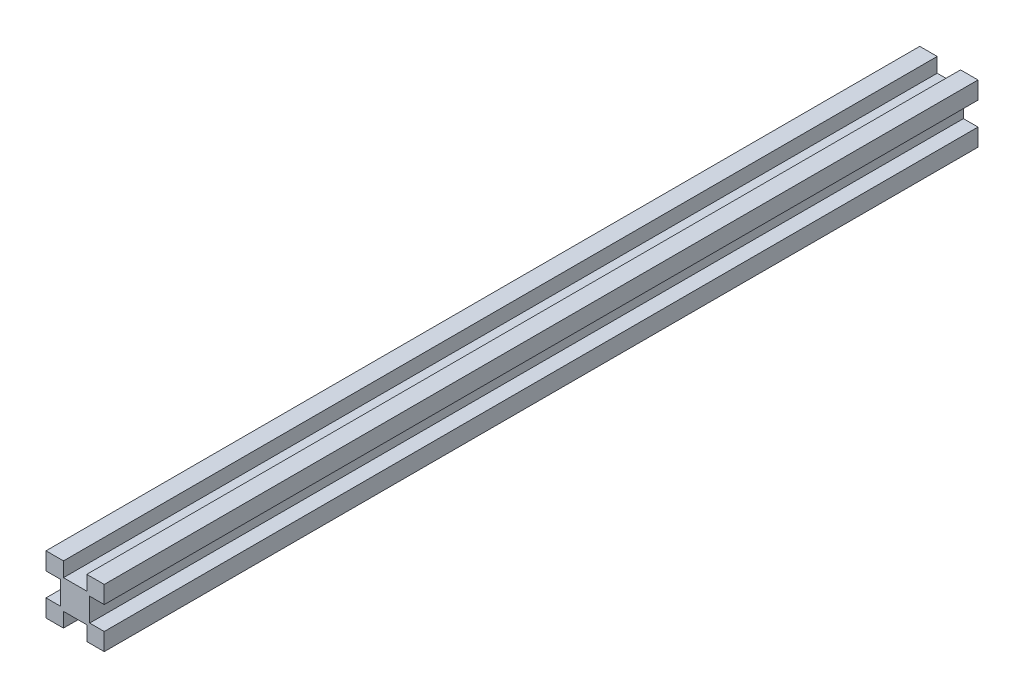
ISO-10303-21;
HEADER;
FILE_DESCRIPTION(('STEP AP214'),'2;1');
FILE_NAME('part.step','',(''),(''),'','','');
FILE_SCHEMA(('AUTOMOTIVE_DESIGN { 1 0 10303 214 1 1 1 1 }'));
ENDSEC;
DATA;
#1=APPLICATION_CONTEXT('core data for automotive mechanical design processes');
#2=APPLICATION_PROTOCOL_DEFINITION('international standard','automotive_design',2000,#1);
#3=PRODUCT_CONTEXT('',#1,'mechanical');
#4=PRODUCT('Part','Part','',(#3));
#5=PRODUCT_RELATED_PRODUCT_CATEGORY('part','',(#4));
#6=PRODUCT_DEFINITION_FORMATION('','',#4);
#7=PRODUCT_DEFINITION_CONTEXT('part definition',#1,'design');
#8=PRODUCT_DEFINITION('design','',#6,#7);
#9=PRODUCT_DEFINITION_SHAPE('','',#8);
#10=(LENGTH_UNIT() NAMED_UNIT(*) SI_UNIT(.MILLI.,.METRE.));
#11=(NAMED_UNIT(*) PLANE_ANGLE_UNIT() SI_UNIT($,.RADIAN.));
#12=(NAMED_UNIT(*) SI_UNIT($,.STERADIAN.) SOLID_ANGLE_UNIT());
#13=UNCERTAINTY_MEASURE_WITH_UNIT(LENGTH_MEASURE(1.E-05),#10,'distance_accuracy_value','');
#14=(GEOMETRIC_REPRESENTATION_CONTEXT(3) GLOBAL_UNCERTAINTY_ASSIGNED_CONTEXT((#13)) GLOBAL_UNIT_ASSIGNED_CONTEXT((#10,
#11,#12)) REPRESENTATION_CONTEXT('',''));
#15=CARTESIAN_POINT('',(0.,0.,0.));
#16=DIRECTION('',(0.,0.,1.));
#17=DIRECTION('',(1.,0.,0.));
#18=AXIS2_PLACEMENT_3D('',#15,#16,#17);
#19=CARTESIAN_POINT('',(-3.5325550493546,14.5416666666667,300.));
#20=DIRECTION('',(-1.,0.,0.));
#21=DIRECTION('',(0.,-1.,0.));
#22=AXIS2_PLACEMENT_3D('',#19,#20,#21);
#23=PLANE('',#22);
#24=DIRECTION('',(0.,1.,0.));
#25=VECTOR('',#24,1.);
#26=CARTESIAN_POINT('',(-3.5325550493546,14.5416666666667,0.));
#27=LINE('',#26,#25);
#28=CARTESIAN_POINT('',(-3.5325550493546,-5.45833333333333,0.));
#29=VERTEX_POINT('',#28);
#30=CARTESIAN_POINT('',(-3.5325550493546,0.541666666666671,0.));
#31=VERTEX_POINT('',#30);
#32=EDGE_CURVE('E226',#29,#31,#27,.T.);
#33=ORIENTED_EDGE('',*,*,#32,.T.);
#34=DIRECTION('',(0.,0.,1.));
#35=VECTOR('',#34,1.);
#36=CARTESIAN_POINT('',(-3.5325550493546,0.541666666666671,-20.));
#37=LINE('',#36,#35);
#38=CARTESIAN_POINT('',(-3.5325550493546,0.541666666666671,300.));
#39=VERTEX_POINT('',#38);
#40=EDGE_CURVE('E350',#31,#39,#37,.T.);
#41=ORIENTED_EDGE('',*,*,#40,.T.);
#42=DIRECTION('',(0.,1.,0.));
#43=VECTOR('',#42,1.);
#44=CARTESIAN_POINT('',(-3.5325550493546,14.5416666666667,300.));
#45=LINE('',#44,#43);
#46=CARTESIAN_POINT('',(-3.5325550493546,-5.45833333333333,300.));
#47=VERTEX_POINT('',#46);
#48=EDGE_CURVE('E385',#47,#39,#45,.T.);
#49=ORIENTED_EDGE('',*,*,#48,.F.);
#50=DIRECTION('',(0.,0.,-1.));
#51=VECTOR('',#50,1.);
#52=CARTESIAN_POINT('',(-3.5325550493546,-5.45833333333333,300.));
#53=LINE('',#52,#51);
#54=EDGE_CURVE('E225',#47,#29,#53,.T.);
#55=ORIENTED_EDGE('',*,*,#54,.T.);
#56=EDGE_LOOP('',(#33,#41,#49,#55));
#57=FACE_BOUND('',#56,.T.);
#58=ADVANCED_FACE('F45',(#57),#23,.F.);
#59=CARTESIAN_POINT('',(-23.5325550493546,14.5416666666667,300.));
#60=DIRECTION('',(0.,-1.,0.));
#61=DIRECTION('',(0.,0.,-1.));
#62=AXIS2_PLACEMENT_3D('',#59,#60,#61);
#63=PLANE('',#62);
#64=DIRECTION('',(-1.,0.,0.));
#65=VECTOR('',#64,1.);
#66=CARTESIAN_POINT('',(-23.5325550493546,14.5416666666667,300.));
#67=LINE('',#66,#65);
#68=CARTESIAN_POINT('',(-17.5325550493546,14.5416666666667,300.));
#69=VERTEX_POINT('',#68);
#70=CARTESIAN_POINT('',(-23.5325550493546,14.5416666666667,300.));
#71=VERTEX_POINT('',#70);
#72=EDGE_CURVE('E218',#69,#71,#67,.T.);
#73=ORIENTED_EDGE('',*,*,#72,.F.);
#74=DIRECTION('',(0.,0.,1.));
#75=VECTOR('',#74,1.);
#76=CARTESIAN_POINT('',(-17.5325550493546,14.5416666666667,-20.));
#77=LINE('',#76,#75);
#78=CARTESIAN_POINT('',(-17.5325550493546,14.5416666666667,0.));
#79=VERTEX_POINT('',#78);
#80=EDGE_CURVE('E325',#79,#69,#77,.T.);
#81=ORIENTED_EDGE('',*,*,#80,.F.);
#82=DIRECTION('',(-1.,0.,0.));
#83=VECTOR('',#82,1.);
#84=CARTESIAN_POINT('',(-23.5325550493546,14.5416666666667,0.));
#85=LINE('',#84,#83);
#86=CARTESIAN_POINT('',(-23.5325550493546,14.5416666666667,0.));
#87=VERTEX_POINT('',#86);
#88=EDGE_CURVE('E230',#79,#87,#85,.T.);
#89=ORIENTED_EDGE('',*,*,#88,.T.);
#90=DIRECTION('',(0.,0.,-1.));
#91=VECTOR('',#90,1.);
#92=CARTESIAN_POINT('',(-23.5325550493546,14.5416666666667,300.));
#93=LINE('',#92,#91);
#94=EDGE_CURVE('E252',#71,#87,#93,.T.);
#95=ORIENTED_EDGE('',*,*,#94,.F.);
#96=EDGE_LOOP('',(#73,#81,#89,#95));
#97=FACE_BOUND('',#96,.T.);
#98=ADVANCED_FACE('F418',(#97),#63,.F.);
#99=CARTESIAN_POINT('',(-23.5325550493546,14.5416666666667,300.));
#100=DIRECTION('',(1.,0.,0.));
#101=DIRECTION('',(0.,1.,0.));
#102=AXIS2_PLACEMENT_3D('',#99,#100,#101);
#103=PLANE('',#102);
#104=DIRECTION('',(0.,-1.,0.));
#105=VECTOR('',#104,1.);
#106=CARTESIAN_POINT('',(-23.5325550493546,14.5416666666667,0.));
#107=LINE('',#106,#105);
#108=CARTESIAN_POINT('',(-23.5325550493546,8.54166666666667,0.));
#109=VERTEX_POINT('',#108);
#110=EDGE_CURVE('E237',#87,#109,#107,.T.);
#111=ORIENTED_EDGE('',*,*,#110,.T.);
#112=DIRECTION('',(0.,0.,1.));
#113=VECTOR('',#112,1.);
#114=CARTESIAN_POINT('',(-23.5325550493546,8.54166666666667,-20.));
#115=LINE('',#114,#113);
#116=CARTESIAN_POINT('',(-23.5325550493546,8.54166666666667,300.));
#117=VERTEX_POINT('',#116);
#118=EDGE_CURVE('E308',#109,#117,#115,.T.);
#119=ORIENTED_EDGE('',*,*,#118,.T.);
#120=DIRECTION('',(0.,-1.,0.));
#121=VECTOR('',#120,1.);
#122=CARTESIAN_POINT('',(-23.5325550493546,14.5416666666667,300.));
#123=LINE('',#122,#121);
#124=EDGE_CURVE('E210',#71,#117,#123,.T.);
#125=ORIENTED_EDGE('',*,*,#124,.F.);
#126=ORIENTED_EDGE('',*,*,#94,.T.);
#127=EDGE_LOOP('',(#111,#119,#125,#126));
#128=FACE_BOUND('',#127,.T.);
#129=ADVANCED_FACE('F422',(#128),#103,.F.);
#130=CARTESIAN_POINT('',(-23.5325550493546,-5.45833333333333,300.));
#131=DIRECTION('',(0.,1.,0.));
#132=DIRECTION('',(0.,0.,1.));
#133=AXIS2_PLACEMENT_3D('',#130,#131,#132);
#134=PLANE('',#133);
#135=DIRECTION('',(1.,0.,0.));
#136=VECTOR('',#135,1.);
#137=CARTESIAN_POINT('',(-23.5325550493546,-5.45833333333333,300.));
#138=LINE('',#137,#136);
#139=CARTESIAN_POINT('',(-9.5325550493546,-5.45833333333333,300.));
#140=VERTEX_POINT('',#139);
#141=EDGE_CURVE('E216',#140,#47,#138,.T.);
#142=ORIENTED_EDGE('',*,*,#141,.F.);
#143=DIRECTION('',(0.,0.,1.));
#144=VECTOR('',#143,1.);
#145=CARTESIAN_POINT('',(-9.5325550493546,-5.45833333333333,-20.));
#146=LINE('',#145,#144);
#147=CARTESIAN_POINT('',(-9.5325550493546,-5.45833333333333,0.));
#148=VERTEX_POINT('',#147);
#149=EDGE_CURVE('E371',#148,#140,#146,.T.);
#150=ORIENTED_EDGE('',*,*,#149,.F.);
#151=DIRECTION('',(1.,0.,0.));
#152=VECTOR('',#151,1.);
#153=CARTESIAN_POINT('',(-23.5325550493546,-5.45833333333333,0.));
#154=LINE('',#153,#152);
#155=EDGE_CURVE('E241',#148,#29,#154,.T.);
#156=ORIENTED_EDGE('',*,*,#155,.T.);
#157=ORIENTED_EDGE('',*,*,#54,.F.);
#158=EDGE_LOOP('',(#142,#150,#156,#157));
#159=FACE_BOUND('',#158,.T.);
#160=ADVANCED_FACE('F442',(#159),#134,.F.);
#161=CARTESIAN_POINT('',(-3.5325550493546,8.54166666666667,300.));
#162=VERTEX_POINT('',#161);
#163=CARTESIAN_POINT('',(-3.5325550493546,14.5416666666667,300.));
#164=VERTEX_POINT('',#163);
#165=EDGE_CURVE('E246',#162,#164,#45,.T.);
#166=ORIENTED_EDGE('',*,*,#165,.F.);
#167=DIRECTION('',(0.,0.,1.));
#168=VECTOR('',#167,1.);
#169=CARTESIAN_POINT('',(-3.5325550493546,8.54166666666667,-20.));
#170=LINE('',#169,#168);
#171=CARTESIAN_POINT('',(-3.5325550493546,8.54166666666667,0.));
#172=VERTEX_POINT('',#171);
#173=EDGE_CURVE('E341',#172,#162,#170,.T.);
#174=ORIENTED_EDGE('',*,*,#173,.F.);
#175=CARTESIAN_POINT('',(-3.5325550493546,14.5416666666667,0.));
#176=VERTEX_POINT('',#175);
#177=EDGE_CURVE('E231',#172,#176,#27,.T.);
#178=ORIENTED_EDGE('',*,*,#177,.T.);
#179=DIRECTION('',(0.,0.,-1.));
#180=VECTOR('',#179,1.);
#181=CARTESIAN_POINT('',(-3.5325550493546,14.5416666666667,300.));
#182=LINE('',#181,#180);
#183=EDGE_CURVE('E256',#164,#176,#182,.T.);
#184=ORIENTED_EDGE('',*,*,#183,.F.);
#185=EDGE_LOOP('',(#166,#174,#178,#184));
#186=FACE_BOUND('',#185,.T.);
#187=ADVANCED_FACE('F47',(#186),#23,.F.);
#188=CARTESIAN_POINT('',(-9.5325550493546,14.5416666666667,0.));
#189=VERTEX_POINT('',#188);
#190=EDGE_CURVE('E232',#176,#189,#85,.T.);
#191=ORIENTED_EDGE('',*,*,#190,.T.);
#192=DIRECTION('',(0.,0.,1.));
#193=VECTOR('',#192,1.);
#194=CARTESIAN_POINT('',(-9.5325550493546,14.5416666666667,-20.));
#195=LINE('',#194,#193);
#196=CARTESIAN_POINT('',(-9.5325550493546,14.5416666666667,300.));
#197=VERTEX_POINT('',#196);
#198=EDGE_CURVE('E321',#189,#197,#195,.T.);
#199=ORIENTED_EDGE('',*,*,#198,.T.);
#200=EDGE_CURVE('E211',#164,#197,#67,.T.);
#201=ORIENTED_EDGE('',*,*,#200,.F.);
#202=ORIENTED_EDGE('',*,*,#183,.T.);
#203=EDGE_LOOP('',(#191,#199,#201,#202));
#204=FACE_BOUND('',#203,.T.);
#205=ADVANCED_FACE('F401',(#204),#63,.F.);
#206=CARTESIAN_POINT('',(-23.5325550493546,0.541666666666668,300.));
#207=VERTEX_POINT('',#206);
#208=CARTESIAN_POINT('',(-23.5325550493546,-5.45833333333333,300.));
#209=VERTEX_POINT('',#208);
#210=EDGE_CURVE('E198',#207,#209,#123,.T.);
#211=ORIENTED_EDGE('',*,*,#210,.F.);
#212=DIRECTION('',(0.,0.,1.));
#213=VECTOR('',#212,1.);
#214=CARTESIAN_POINT('',(-23.5325550493546,0.541666666666668,-20.));
#215=LINE('',#214,#213);
#216=CARTESIAN_POINT('',(-23.5325550493546,0.541666666666668,0.));
#217=VERTEX_POINT('',#216);
#218=EDGE_CURVE('E181',#217,#207,#215,.T.);
#219=ORIENTED_EDGE('',*,*,#218,.F.);
#220=CARTESIAN_POINT('',(-23.5325550493546,-5.45833333333333,0.));
#221=VERTEX_POINT('',#220);
#222=EDGE_CURVE('E236',#217,#221,#107,.T.);
#223=ORIENTED_EDGE('',*,*,#222,.T.);
#224=DIRECTION('',(0.,0.,-1.));
#225=VECTOR('',#224,1.);
#226=CARTESIAN_POINT('',(-23.5325550493546,-5.45833333333333,300.));
#227=LINE('',#226,#225);
#228=EDGE_CURVE('E207',#209,#221,#227,.T.);
#229=ORIENTED_EDGE('',*,*,#228,.F.);
#230=EDGE_LOOP('',(#211,#219,#223,#229));
#231=FACE_BOUND('',#230,.T.);
#232=ADVANCED_FACE('F205',(#231),#103,.F.);
#233=CARTESIAN_POINT('',(-17.5325550493546,-5.45833333333333,0.));
#234=VERTEX_POINT('',#233);
#235=EDGE_CURVE('E242',#221,#234,#154,.T.);
#236=ORIENTED_EDGE('',*,*,#235,.T.);
#237=DIRECTION('',(0.,0.,1.));
#238=VECTOR('',#237,1.);
#239=CARTESIAN_POINT('',(-17.5325550493546,-5.45833333333333,-20.));
#240=LINE('',#239,#238);
#241=CARTESIAN_POINT('',(-17.5325550493546,-5.45833333333333,300.));
#242=VERTEX_POINT('',#241);
#243=EDGE_CURVE('E367',#234,#242,#240,.T.);
#244=ORIENTED_EDGE('',*,*,#243,.T.);
#245=EDGE_CURVE('E222',#209,#242,#138,.T.);
#246=ORIENTED_EDGE('',*,*,#245,.F.);
#247=ORIENTED_EDGE('',*,*,#228,.T.);
#248=EDGE_LOOP('',(#236,#244,#246,#247));
#249=FACE_BOUND('',#248,.T.);
#250=ADVANCED_FACE('F449',(#249),#134,.F.);
#251=CARTESIAN_POINT('',(0.,0.,300.));
#252=DIRECTION('',(0.,0.,1.));
#253=DIRECTION('',(1.,0.,0.));
#254=AXIS2_PLACEMENT_3D('',#251,#252,#253);
#255=PLANE('',#254);
#256=DIRECTION('',(-1.,0.,0.));
#257=VECTOR('',#256,1.);
#258=CARTESIAN_POINT('',(-23.5325550493546,8.54166666666667,300.));
#259=LINE('',#258,#257);
#260=CARTESIAN_POINT('',(-18.5325550493546,8.54166666666667,300.));
#261=VERTEX_POINT('',#260);
#262=EDGE_CURVE('E192',#261,#117,#259,.T.);
#263=ORIENTED_EDGE('',*,*,#262,.F.);
#264=DIRECTION('',(0.,1.,0.));
#265=VECTOR('',#264,1.);
#266=CARTESIAN_POINT('',(-18.5325550493546,8.54166666666667,300.));
#267=LINE('',#266,#265);
#268=CARTESIAN_POINT('',(-18.5325550493546,0.541666666666668,300.));
#269=VERTEX_POINT('',#268);
#270=EDGE_CURVE('E201',#269,#261,#267,.T.);
#271=ORIENTED_EDGE('',*,*,#270,.F.);
#272=DIRECTION('',(1.,0.,0.));
#273=VECTOR('',#272,1.);
#274=CARTESIAN_POINT('',(-18.5325550493546,0.541666666666668,300.));
#275=LINE('',#274,#273);
#276=EDGE_CURVE('E184',#207,#269,#275,.T.);
#277=ORIENTED_EDGE('',*,*,#276,.F.);
#278=ORIENTED_EDGE('',*,*,#210,.T.);
#279=ORIENTED_EDGE('',*,*,#245,.T.);
#280=DIRECTION('',(0.,-1.,0.));
#281=VECTOR('',#280,1.);
#282=CARTESIAN_POINT('',(-17.5325550493546,-0.458333333333331,300.));
#283=LINE('',#282,#281);
#284=CARTESIAN_POINT('',(-17.5325550493546,-0.458333333333331,300.));
#285=VERTEX_POINT('',#284);
#286=EDGE_CURVE('E380',#285,#242,#283,.T.);
#287=ORIENTED_EDGE('',*,*,#286,.F.);
#288=DIRECTION('',(-1.,0.,0.));
#289=VECTOR('',#288,1.);
#290=CARTESIAN_POINT('',(-13.5325550493546,-0.458333333333328,300.));
#291=LINE('',#290,#289);
#292=CARTESIAN_POINT('',(-9.5325550493546,-0.458333333333333,300.));
#293=VERTEX_POINT('',#292);
#294=EDGE_CURVE('E354',#293,#285,#291,.T.);
#295=ORIENTED_EDGE('',*,*,#294,.F.);
#296=DIRECTION('',(0.,1.,0.));
#297=VECTOR('',#296,1.);
#298=CARTESIAN_POINT('',(-9.5325550493546,-0.458333333333333,300.));
#299=LINE('',#298,#297);
#300=EDGE_CURVE('E366',#140,#293,#299,.T.);
#301=ORIENTED_EDGE('',*,*,#300,.F.);
#302=ORIENTED_EDGE('',*,*,#141,.T.);
#303=ORIENTED_EDGE('',*,*,#48,.T.);
#304=DIRECTION('',(1.,0.,0.));
#305=VECTOR('',#304,1.);
#306=CARTESIAN_POINT('',(-8.5325550493546,0.541666666666668,300.));
#307=LINE('',#306,#305);
#308=CARTESIAN_POINT('',(-8.5325550493546,0.541666666666668,300.));
#309=VERTEX_POINT('',#308);
#310=EDGE_CURVE('E344',#309,#39,#307,.T.);
#311=ORIENTED_EDGE('',*,*,#310,.F.);
#312=DIRECTION('',(0.,-1.,0.));
#313=VECTOR('',#312,1.);
#314=CARTESIAN_POINT('',(-8.5325550493546,8.54166666666667,300.));
#315=LINE('',#314,#313);
#316=CARTESIAN_POINT('',(-8.5325550493546,8.54166666666667,300.));
#317=VERTEX_POINT('',#316);
#318=EDGE_CURVE('E357',#317,#309,#315,.T.);
#319=ORIENTED_EDGE('',*,*,#318,.F.);
#320=DIRECTION('',(-1.,0.,0.));
#321=VECTOR('',#320,1.);
#322=CARTESIAN_POINT('',(-3.5325550493546,8.54166666666667,300.));
#323=LINE('',#322,#321);
#324=EDGE_CURVE('E331',#162,#317,#323,.T.);
#325=ORIENTED_EDGE('',*,*,#324,.F.);
#326=ORIENTED_EDGE('',*,*,#165,.T.);
#327=ORIENTED_EDGE('',*,*,#200,.T.);
#328=DIRECTION('',(0.,1.,0.));
#329=VECTOR('',#328,1.);
#330=CARTESIAN_POINT('',(-9.5325550493546,9.54166666666667,300.));
#331=LINE('',#330,#329);
#332=CARTESIAN_POINT('',(-9.5325550493546,9.54166666666667,300.));
#333=VERTEX_POINT('',#332);
#334=EDGE_CURVE('E203',#333,#197,#331,.T.);
#335=ORIENTED_EDGE('',*,*,#334,.F.);
#336=DIRECTION('',(1.,0.,0.));
#337=VECTOR('',#336,1.);
#338=CARTESIAN_POINT('',(-13.5325550493546,9.54166666666667,300.));
#339=LINE('',#338,#337);
#340=CARTESIAN_POINT('',(-17.5325550493546,9.54166666666667,300.));
#341=VERTEX_POINT('',#340);
#342=EDGE_CURVE('E320',#341,#333,#339,.T.);
#343=ORIENTED_EDGE('',*,*,#342,.F.);
#344=DIRECTION('',(0.,-1.,0.));
#345=VECTOR('',#344,1.);
#346=CARTESIAN_POINT('',(-17.5325550493546,9.54166666666667,300.));
#347=LINE('',#346,#345);
#348=EDGE_CURVE('E335',#69,#341,#347,.T.);
#349=ORIENTED_EDGE('',*,*,#348,.F.);
#350=ORIENTED_EDGE('',*,*,#72,.T.);
#351=ORIENTED_EDGE('',*,*,#124,.T.);
#352=EDGE_LOOP('',(#263,#271,#277,#278,#279,#287,#295,#301,#302,#303,#311,#319,#325,#326,#327,
#335,#343,#349,#350,#351));
#353=FACE_BOUND('',#352,.T.);
#354=ADVANCED_FACE('F196',(#353),#255,.T.);
#355=CARTESIAN_POINT('',(0.,0.,0.));
#356=DIRECTION('',(0.,0.,1.));
#357=DIRECTION('',(1.,0.,0.));
#358=AXIS2_PLACEMENT_3D('',#355,#356,#357);
#359=PLANE('',#358);
#360=DIRECTION('',(0.,1.,0.));
#361=VECTOR('',#360,1.);
#362=CARTESIAN_POINT('',(-18.5325550493546,0.,0.));
#363=LINE('',#362,#361);
#364=CARTESIAN_POINT('',(-18.5325550493546,0.541666666666668,0.));
#365=VERTEX_POINT('',#364);
#366=CARTESIAN_POINT('',(-18.5325550493546,8.54166666666667,0.));
#367=VERTEX_POINT('',#366);
#368=EDGE_CURVE('E54',#365,#367,#363,.T.);
#369=ORIENTED_EDGE('',*,*,#368,.T.);
#370=DIRECTION('',(-1.,0.,0.));
#371=VECTOR('',#370,1.);
#372=CARTESIAN_POINT('',(0.,8.54166666666667,0.));
#373=LINE('',#372,#371);
#374=EDGE_CURVE('E11',#367,#109,#373,.T.);
#375=ORIENTED_EDGE('',*,*,#374,.T.);
#376=ORIENTED_EDGE('',*,*,#110,.F.);
#377=ORIENTED_EDGE('',*,*,#88,.F.);
#378=DIRECTION('',(0.,-1.,0.));
#379=VECTOR('',#378,1.);
#380=CARTESIAN_POINT('',(-17.5325550493546,0.,0.));
#381=LINE('',#380,#379);
#382=CARTESIAN_POINT('',(-17.5325550493546,9.54166666666667,0.));
#383=VERTEX_POINT('',#382);
#384=EDGE_CURVE('E292',#79,#383,#381,.T.);
#385=ORIENTED_EDGE('',*,*,#384,.T.);
#386=DIRECTION('',(1.,0.,0.));
#387=VECTOR('',#386,1.);
#388=CARTESIAN_POINT('',(0.,9.54166666666666,0.));
#389=LINE('',#388,#387);
#390=CARTESIAN_POINT('',(-9.5325550493546,9.54166666666667,0.));
#391=VERTEX_POINT('',#390);
#392=EDGE_CURVE('E288',#383,#391,#389,.T.);
#393=ORIENTED_EDGE('',*,*,#392,.T.);
#394=DIRECTION('',(0.,1.,0.));
#395=VECTOR('',#394,1.);
#396=CARTESIAN_POINT('',(-9.5325550493546,0.,0.));
#397=LINE('',#396,#395);
#398=EDGE_CURVE('E284',#391,#189,#397,.T.);
#399=ORIENTED_EDGE('',*,*,#398,.T.);
#400=ORIENTED_EDGE('',*,*,#190,.F.);
#401=ORIENTED_EDGE('',*,*,#177,.F.);
#402=DIRECTION('',(-1.,0.,0.));
#403=VECTOR('',#402,1.);
#404=CARTESIAN_POINT('',(0.,8.54166666666668,0.));
#405=LINE('',#404,#403);
#406=CARTESIAN_POINT('',(-8.5325550493546,8.54166666666667,0.));
#407=VERTEX_POINT('',#406);
#408=EDGE_CURVE('E272',#172,#407,#405,.T.);
#409=ORIENTED_EDGE('',*,*,#408,.T.);
#410=DIRECTION('',(0.,-1.,0.));
#411=VECTOR('',#410,1.);
#412=CARTESIAN_POINT('',(-8.5325550493546,0.,0.));
#413=LINE('',#412,#411);
#414=CARTESIAN_POINT('',(-8.5325550493546,0.541666666666668,0.));
#415=VERTEX_POINT('',#414);
#416=EDGE_CURVE('E276',#407,#415,#413,.T.);
#417=ORIENTED_EDGE('',*,*,#416,.T.);
#418=DIRECTION('',(1.,0.,0.));
#419=VECTOR('',#418,1.);
#420=CARTESIAN_POINT('',(0.,0.541666666666673,0.));
#421=LINE('',#420,#419);
#422=EDGE_CURVE('E280',#415,#31,#421,.T.);
#423=ORIENTED_EDGE('',*,*,#422,.T.);
#424=ORIENTED_EDGE('',*,*,#32,.F.);
#425=ORIENTED_EDGE('',*,*,#155,.F.);
#426=DIRECTION('',(0.,1.,0.));
#427=VECTOR('',#426,1.);
#428=CARTESIAN_POINT('',(-9.5325550493546,0.,0.));
#429=LINE('',#428,#427);
#430=CARTESIAN_POINT('',(-9.5325550493546,-0.458333333333333,0.));
#431=VERTEX_POINT('',#430);
#432=EDGE_CURVE('E268',#148,#431,#429,.T.);
#433=ORIENTED_EDGE('',*,*,#432,.T.);
#434=DIRECTION('',(-1.,0.,0.));
#435=VECTOR('',#434,1.);
#436=CARTESIAN_POINT('',(0.,-0.458333333333316,0.));
#437=LINE('',#436,#435);
#438=CARTESIAN_POINT('',(-17.5325550493546,-0.458333333333331,0.));
#439=VERTEX_POINT('',#438);
#440=EDGE_CURVE('E260',#431,#439,#437,.T.);
#441=ORIENTED_EDGE('',*,*,#440,.T.);
#442=DIRECTION('',(0.,-1.,0.));
#443=VECTOR('',#442,1.);
#444=CARTESIAN_POINT('',(-17.5325550493546,0.,0.));
#445=LINE('',#444,#443);
#446=EDGE_CURVE('E264',#439,#234,#445,.T.);
#447=ORIENTED_EDGE('',*,*,#446,.T.);
#448=ORIENTED_EDGE('',*,*,#235,.F.);
#449=ORIENTED_EDGE('',*,*,#222,.F.);
#450=DIRECTION('',(1.,0.,0.));
#451=VECTOR('',#450,1.);
#452=CARTESIAN_POINT('',(0.,0.541666666666671,0.));
#453=LINE('',#452,#451);
#454=EDGE_CURVE('E187',#217,#365,#453,.T.);
#455=ORIENTED_EDGE('',*,*,#454,.T.);
#456=EDGE_LOOP('',(#369,#375,#376,#377,#385,#393,#399,#400,#401,#409,#417,#423,#424,#425,#433,
#441,#447,#448,#449,#455));
#457=FACE_BOUND('',#456,.T.);
#458=ADVANCED_FACE('F300',(#457),#359,.F.);
#459=CARTESIAN_POINT('',(-9.5325550493546,-0.458333333333333,-20.));
#460=DIRECTION('',(1.,0.,0.));
#461=DIRECTION('',(0.,0.,-1.));
#462=AXIS2_PLACEMENT_3D('',#459,#460,#461);
#463=PLANE('',#462);
#464=ORIENTED_EDGE('',*,*,#149,.T.);
#465=ORIENTED_EDGE('',*,*,#300,.T.);
#466=DIRECTION('',(0.,0.,1.));
#467=VECTOR('',#466,1.);
#468=CARTESIAN_POINT('',(-9.5325550493546,-0.458333333333333,-20.));
#469=LINE('',#468,#467);
#470=EDGE_CURVE('E374',#431,#293,#469,.T.);
#471=ORIENTED_EDGE('',*,*,#470,.F.);
#472=ORIENTED_EDGE('',*,*,#432,.F.);
#473=EDGE_LOOP('',(#464,#465,#471,#472));
#474=FACE_BOUND('',#473,.T.);
#475=ADVANCED_FACE('F474',(#474),#463,.F.);
#476=CARTESIAN_POINT('',(-17.5325550493546,-0.458333333333331,-20.));
#477=DIRECTION('',(-1.,0.,0.));
#478=DIRECTION('',(0.,0.,1.));
#479=AXIS2_PLACEMENT_3D('',#476,#477,#478);
#480=PLANE('',#479);
#481=DIRECTION('',(0.,0.,1.));
#482=VECTOR('',#481,1.);
#483=CARTESIAN_POINT('',(-17.5325550493546,-0.458333333333331,-20.));
#484=LINE('',#483,#482);
#485=EDGE_CURVE('E363',#439,#285,#484,.T.);
#486=ORIENTED_EDGE('',*,*,#485,.T.);
#487=ORIENTED_EDGE('',*,*,#286,.T.);
#488=ORIENTED_EDGE('',*,*,#243,.F.);
#489=ORIENTED_EDGE('',*,*,#446,.F.);
#490=EDGE_LOOP('',(#486,#487,#488,#489));
#491=FACE_BOUND('',#490,.T.);
#492=ADVANCED_FACE('F466',(#491),#480,.F.);
#493=CARTESIAN_POINT('',(-13.5325550493546,-0.458333333333328,-20.));
#494=DIRECTION('',(0.,1.,0.));
#495=DIRECTION('',(-1.,0.,0.));
#496=AXIS2_PLACEMENT_3D('',#493,#494,#495);
#497=PLANE('',#496);
#498=ORIENTED_EDGE('',*,*,#470,.T.);
#499=ORIENTED_EDGE('',*,*,#294,.T.);
#500=ORIENTED_EDGE('',*,*,#485,.F.);
#501=ORIENTED_EDGE('',*,*,#440,.F.);
#502=EDGE_LOOP('',(#498,#499,#500,#501));
#503=FACE_BOUND('',#502,.T.);
#504=ADVANCED_FACE('F471',(#503),#497,.F.);
#505=CARTESIAN_POINT('',(-8.5325550493546,0.541666666666668,-20.));
#506=DIRECTION('',(0.,-1.,0.));
#507=DIRECTION('',(1.,0.,0.));
#508=AXIS2_PLACEMENT_3D('',#505,#506,#507);
#509=PLANE('',#508);
#510=DIRECTION('',(0.,0.,1.));
#511=VECTOR('',#510,1.);
#512=CARTESIAN_POINT('',(-8.5325550493546,0.541666666666668,-20.));
#513=LINE('',#512,#511);
#514=EDGE_CURVE('E347',#415,#309,#513,.T.);
#515=ORIENTED_EDGE('',*,*,#514,.T.);
#516=ORIENTED_EDGE('',*,*,#310,.T.);
#517=ORIENTED_EDGE('',*,*,#40,.F.);
#518=ORIENTED_EDGE('',*,*,#422,.F.);
#519=EDGE_LOOP('',(#515,#516,#517,#518));
#520=FACE_BOUND('',#519,.T.);
#521=ADVANCED_FACE('F483',(#520),#509,.F.);
#522=CARTESIAN_POINT('',(-8.5325550493546,8.54166666666667,-20.));
#523=DIRECTION('',(-1.,0.,0.));
#524=DIRECTION('',(0.,-1.,0.));
#525=AXIS2_PLACEMENT_3D('',#522,#523,#524);
#526=PLANE('',#525);
#527=DIRECTION('',(0.,0.,1.));
#528=VECTOR('',#527,1.);
#529=CARTESIAN_POINT('',(-8.5325550493546,8.54166666666667,-20.));
#530=LINE('',#529,#528);
#531=EDGE_CURVE('E69',#407,#317,#530,.T.);
#532=ORIENTED_EDGE('',*,*,#531,.T.);
#533=ORIENTED_EDGE('',*,*,#318,.T.);
#534=ORIENTED_EDGE('',*,*,#514,.F.);
#535=ORIENTED_EDGE('',*,*,#416,.F.);
#536=EDGE_LOOP('',(#532,#533,#534,#535));
#537=FACE_BOUND('',#536,.T.);
#538=ADVANCED_FACE('F486',(#537),#526,.F.);
#539=CARTESIAN_POINT('',(-3.5325550493546,8.54166666666667,-20.));
#540=DIRECTION('',(0.,1.,0.));
#541=DIRECTION('',(-1.,0.,0.));
#542=AXIS2_PLACEMENT_3D('',#539,#540,#541);
#543=PLANE('',#542);
#544=ORIENTED_EDGE('',*,*,#173,.T.);
#545=ORIENTED_EDGE('',*,*,#324,.T.);
#546=ORIENTED_EDGE('',*,*,#531,.F.);
#547=ORIENTED_EDGE('',*,*,#408,.F.);
#548=EDGE_LOOP('',(#544,#545,#546,#547));
#549=FACE_BOUND('',#548,.T.);
#550=ADVANCED_FACE('F487',(#549),#543,.F.);
#551=CARTESIAN_POINT('',(-13.5325550493546,9.54166666666667,-20.));
#552=DIRECTION('',(0.,-1.,0.));
#553=DIRECTION('',(1.,0.,0.));
#554=AXIS2_PLACEMENT_3D('',#551,#552,#553);
#555=PLANE('',#554);
#556=DIRECTION('',(0.,0.,1.));
#557=VECTOR('',#556,1.);
#558=CARTESIAN_POINT('',(-17.5325550493546,9.54166666666667,-20.));
#559=LINE('',#558,#557);
#560=EDGE_CURVE('E328',#383,#341,#559,.T.);
#561=ORIENTED_EDGE('',*,*,#560,.T.);
#562=ORIENTED_EDGE('',*,*,#342,.T.);
#563=DIRECTION('',(0.,0.,1.));
#564=VECTOR('',#563,1.);
#565=CARTESIAN_POINT('',(-9.5325550493546,9.54166666666667,-20.));
#566=LINE('',#565,#564);
#567=EDGE_CURVE('E317',#391,#333,#566,.T.);
#568=ORIENTED_EDGE('',*,*,#567,.F.);
#569=ORIENTED_EDGE('',*,*,#392,.F.);
#570=EDGE_LOOP('',(#561,#562,#568,#569));
#571=FACE_BOUND('',#570,.T.);
#572=ADVANCED_FACE('F409',(#571),#555,.F.);
#573=CARTESIAN_POINT('',(-17.5325550493546,9.54166666666667,-20.));
#574=DIRECTION('',(-1.,0.,0.));
#575=DIRECTION('',(0.,0.,1.));
#576=AXIS2_PLACEMENT_3D('',#573,#574,#575);
#577=PLANE('',#576);
#578=ORIENTED_EDGE('',*,*,#80,.T.);
#579=ORIENTED_EDGE('',*,*,#348,.T.);
#580=ORIENTED_EDGE('',*,*,#560,.F.);
#581=ORIENTED_EDGE('',*,*,#384,.F.);
#582=EDGE_LOOP('',(#578,#579,#580,#581));
#583=FACE_BOUND('',#582,.T.);
#584=ADVANCED_FACE('F434',(#583),#577,.F.);
#585=CARTESIAN_POINT('',(-9.5325550493546,9.54166666666667,-20.));
#586=DIRECTION('',(1.,0.,0.));
#587=DIRECTION('',(0.,0.,-1.));
#588=AXIS2_PLACEMENT_3D('',#585,#586,#587);
#589=PLANE('',#588);
#590=ORIENTED_EDGE('',*,*,#567,.T.);
#591=ORIENTED_EDGE('',*,*,#334,.T.);
#592=ORIENTED_EDGE('',*,*,#198,.F.);
#593=ORIENTED_EDGE('',*,*,#398,.F.);
#594=EDGE_LOOP('',(#590,#591,#592,#593));
#595=FACE_BOUND('',#594,.T.);
#596=ADVANCED_FACE('F407',(#595),#589,.F.);
#597=CARTESIAN_POINT('',(-23.5325550493546,8.54166666666667,-20.));
#598=DIRECTION('',(0.,1.,0.));
#599=DIRECTION('',(0.,0.,1.));
#600=AXIS2_PLACEMENT_3D('',#597,#598,#599);
#601=PLANE('',#600);
#602=DIRECTION('',(0.,0.,1.));
#603=VECTOR('',#602,1.);
#604=CARTESIAN_POINT('',(-18.5325550493546,8.54166666666667,-20.));
#605=LINE('',#604,#603);
#606=EDGE_CURVE('E305',#367,#261,#605,.T.);
#607=ORIENTED_EDGE('',*,*,#606,.T.);
#608=ORIENTED_EDGE('',*,*,#262,.T.);
#609=ORIENTED_EDGE('',*,*,#118,.F.);
#610=ORIENTED_EDGE('',*,*,#374,.F.);
#611=EDGE_LOOP('',(#607,#608,#609,#610));
#612=FACE_BOUND('',#611,.T.);
#613=ADVANCED_FACE('F426',(#612),#601,.F.);
#614=CARTESIAN_POINT('',(-18.5325550493546,8.54166666666667,-20.));
#615=DIRECTION('',(1.,0.,0.));
#616=DIRECTION('',(0.,0.,-1.));
#617=AXIS2_PLACEMENT_3D('',#614,#615,#616);
#618=PLANE('',#617);
#619=DIRECTION('',(0.,0.,1.));
#620=VECTOR('',#619,1.);
#621=CARTESIAN_POINT('',(-18.5325550493546,0.541666666666668,-20.));
#622=LINE('',#621,#620);
#623=EDGE_CURVE('E61',#365,#269,#622,.T.);
#624=ORIENTED_EDGE('',*,*,#623,.T.);
#625=ORIENTED_EDGE('',*,*,#270,.T.);
#626=ORIENTED_EDGE('',*,*,#606,.F.);
#627=ORIENTED_EDGE('',*,*,#368,.F.);
#628=EDGE_LOOP('',(#624,#625,#626,#627));
#629=FACE_BOUND('',#628,.T.);
#630=ADVANCED_FACE('F304',(#629),#618,.F.);
#631=CARTESIAN_POINT('',(-18.5325550493546,0.541666666666668,-20.));
#632=DIRECTION('',(0.,-1.,0.));
#633=DIRECTION('',(1.,0.,0.));
#634=AXIS2_PLACEMENT_3D('',#631,#632,#633);
#635=PLANE('',#634);
#636=ORIENTED_EDGE('',*,*,#218,.T.);
#637=ORIENTED_EDGE('',*,*,#276,.T.);
#638=ORIENTED_EDGE('',*,*,#623,.F.);
#639=ORIENTED_EDGE('',*,*,#454,.F.);
#640=EDGE_LOOP('',(#636,#637,#638,#639));
#641=FACE_BOUND('',#640,.T.);
#642=ADVANCED_FACE('F183',(#641),#635,.F.);
#643=CLOSED_SHELL('',(#58,#98,#129,#160,#187,#205,#232,#250,#354,#458,#475,#492,#504,#521,#538,
#550,#572,#584,#596,#613,#630,#642));
#644=MANIFOLD_SOLID_BREP('B2',#643);
#645=ADVANCED_BREP_SHAPE_REPRESENTATION('',(#18,#644),#14);
#646=SHAPE_DEFINITION_REPRESENTATION(#9,#645);
ENDSEC;
END-ISO-10303-21;
